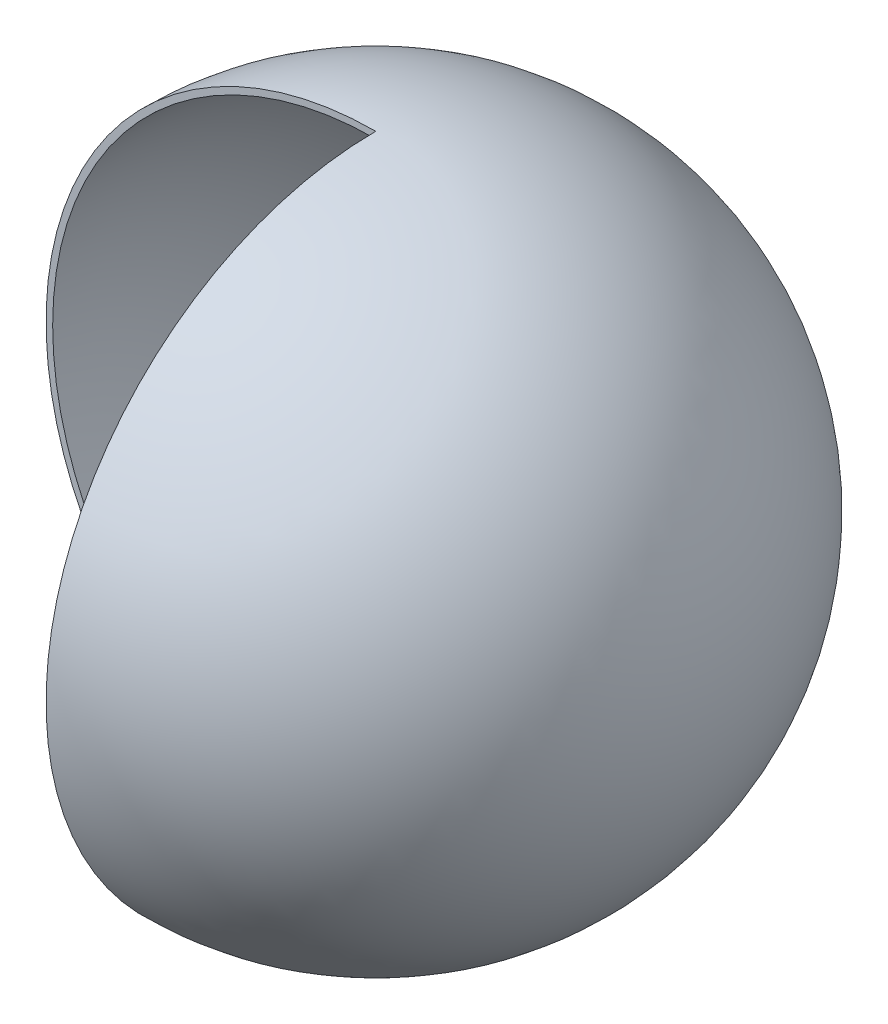
ISO-10303-21;
HEADER;
FILE_DESCRIPTION(('STEP AP214'),'2;1');
FILE_NAME('part.step','',(''),(''),'','','');
FILE_SCHEMA(('AUTOMOTIVE_DESIGN { 1 0 10303 214 1 1 1 1 }'));
ENDSEC;
DATA;
#1=APPLICATION_CONTEXT('core data for automotive mechanical design processes');
#2=APPLICATION_PROTOCOL_DEFINITION('international standard','automotive_design',2000,#1);
#3=PRODUCT_CONTEXT('',#1,'mechanical');
#4=PRODUCT('Part','Part','',(#3));
#5=PRODUCT_RELATED_PRODUCT_CATEGORY('part','',(#4));
#6=PRODUCT_DEFINITION_FORMATION('','',#4);
#7=PRODUCT_DEFINITION_CONTEXT('part definition',#1,'design');
#8=PRODUCT_DEFINITION('design','',#6,#7);
#9=PRODUCT_DEFINITION_SHAPE('','',#8);
#10=(LENGTH_UNIT() NAMED_UNIT(*) SI_UNIT(.MILLI.,.METRE.));
#11=(NAMED_UNIT(*) PLANE_ANGLE_UNIT() SI_UNIT($,.RADIAN.));
#12=(NAMED_UNIT(*) SI_UNIT($,.STERADIAN.) SOLID_ANGLE_UNIT());
#13=UNCERTAINTY_MEASURE_WITH_UNIT(LENGTH_MEASURE(1.E-05),#10,'distance_accuracy_value','');
#14=(GEOMETRIC_REPRESENTATION_CONTEXT(3) GLOBAL_UNCERTAINTY_ASSIGNED_CONTEXT((#13)) GLOBAL_UNIT_ASSIGNED_CONTEXT((#10,
#11,#12)) REPRESENTATION_CONTEXT('',''));
#15=CARTESIAN_POINT('',(0.,0.,0.));
#16=DIRECTION('',(0.,0.,1.));
#17=DIRECTION('',(1.,0.,0.));
#18=AXIS2_PLACEMENT_3D('',#15,#16,#17);
#19=CARTESIAN_POINT('',(0.,0.,0.));
#20=DIRECTION('',(1.,0.,0.));
#21=DIRECTION('',(0.,0.,-1.));
#22=AXIS2_PLACEMENT_3D('',#19,#20,#21);
#23=PLANE('',#22);
#24=CARTESIAN_POINT('',(0.,0.,0.));
#25=DIRECTION('',(1.,0.,0.));
#26=DIRECTION('',(0.,0.,-1.));
#27=AXIS2_PLACEMENT_3D('',#24,#25,#26);
#28=CIRCLE('',#27,147.5);
#29=CARTESIAN_POINT('',(0.,147.5,0.));
#30=VERTEX_POINT('',#29);
#31=CARTESIAN_POINT('',(0.,-147.5,0.));
#32=VERTEX_POINT('',#31);
#33=EDGE_CURVE('E54',#30,#32,#28,.T.);
#34=ORIENTED_EDGE('',*,*,#33,.T.);
#35=DIRECTION('',(0.,1.,0.));
#36=VECTOR('',#35,1.);
#37=CARTESIAN_POINT('',(0.,0.,0.));
#38=LINE('',#37,#36);
#39=CARTESIAN_POINT('',(0.,-150.5,0.));
#40=VERTEX_POINT('',#39);
#41=EDGE_CURVE('E49',#40,#32,#38,.T.);
#42=ORIENTED_EDGE('',*,*,#41,.F.);
#43=CARTESIAN_POINT('',(0.,0.,0.));
#44=DIRECTION('',(1.,0.,0.));
#45=DIRECTION('',(0.,0.,-1.));
#46=AXIS2_PLACEMENT_3D('',#43,#44,#45);
#47=CIRCLE('',#46,150.5);
#48=CARTESIAN_POINT('',(0.,150.5,0.));
#49=VERTEX_POINT('',#48);
#50=EDGE_CURVE('E11',#49,#40,#47,.T.);
#51=ORIENTED_EDGE('',*,*,#50,.F.);
#52=EDGE_CURVE('E77',#30,#49,#38,.T.);
#53=ORIENTED_EDGE('',*,*,#52,.F.);
#54=EDGE_LOOP('',(#34,#42,#51,#53));
#55=FACE_BOUND('',#54,.T.);
#56=ADVANCED_FACE('F45',(#55),#23,.F.);
#57=CARTESIAN_POINT('',(0.,0.,0.));
#58=DIRECTION('',(0.,-1.,0.));
#59=DIRECTION('',(-1.,0.,0.));
#60=AXIS2_PLACEMENT_3D('',#57,#58,#59);
#61=SPHERICAL_SURFACE('',#60,150.5);
#62=ORIENTED_EDGE('',*,*,#50,.T.);
#63=CARTESIAN_POINT('',(0.,0.,0.));
#64=DIRECTION('',(0.,0.,1.));
#65=DIRECTION('',(1.,0.,0.));
#66=AXIS2_PLACEMENT_3D('',#63,#64,#65);
#67=CIRCLE('',#66,150.5);
#68=EDGE_CURVE('E83',#49,#40,#67,.T.);
#69=ORIENTED_EDGE('',*,*,#68,.F.);
#70=EDGE_LOOP('',(#62,#69));
#71=FACE_BOUND('',#70,.T.);
#72=CARTESIAN_POINT('',(0.,0.,-129.832));
#73=DIRECTION('',(0.,0.,1.));
#74=DIRECTION('',(1.,0.,0.));
#75=AXIS2_PLACEMENT_3D('',#72,#73,#74);
#76=CIRCLE('',#75,76.1176837272391);
#77=CARTESIAN_POINT('',(76.1176837272391,0.,-129.832));
#78=VERTEX_POINT('',#77);
#79=EDGE_CURVE('E80',#78,#78,#76,.F.);
#80=ORIENTED_EDGE('',*,*,#79,.F.);
#81=EDGE_LOOP('',(#80));
#82=FACE_BOUND('',#81,.T.);
#83=ADVANCED_FACE('F47',(#71,#82),#61,.T.);
#84=CARTESIAN_POINT('',(0.,0.,0.));
#85=DIRECTION('',(0.,-1.,0.));
#86=DIRECTION('',(1.,0.,0.));
#87=AXIS2_PLACEMENT_3D('',#84,#85,#86);
#88=SPHERICAL_SURFACE('',#87,147.5);
#89=ORIENTED_EDGE('',*,*,#33,.F.);
#90=CARTESIAN_POINT('',(0.,0.,0.));
#91=DIRECTION('',(0.,0.,1.));
#92=DIRECTION('',(1.,0.,0.));
#93=AXIS2_PLACEMENT_3D('',#90,#91,#92);
#94=CIRCLE('',#93,147.5);
#95=EDGE_CURVE('E75',#30,#32,#94,.T.);
#96=ORIENTED_EDGE('',*,*,#95,.T.);
#97=EDGE_LOOP('',(#89,#96));
#98=FACE_BOUND('',#97,.T.);
#99=CARTESIAN_POINT('',(0.,0.,-129.832));
#100=DIRECTION('',(0.,0.,1.));
#101=DIRECTION('',(1.,0.,0.));
#102=AXIS2_PLACEMENT_3D('',#99,#100,#101);
#103=CIRCLE('',#102,69.9992983964839);
#104=CARTESIAN_POINT('',(69.9992983964839,0.,-129.832));
#105=VERTEX_POINT('',#104);
#106=EDGE_CURVE('E82',#105,#105,#103,.T.);
#107=ORIENTED_EDGE('',*,*,#106,.F.);
#108=EDGE_LOOP('',(#107));
#109=FACE_BOUND('',#108,.T.);
#110=ADVANCED_FACE('F72',(#98,#109),#88,.F.);
#111=CARTESIAN_POINT('',(0.,0.,0.));
#112=DIRECTION('',(0.,0.,1.));
#113=DIRECTION('',(1.,0.,0.));
#114=AXIS2_PLACEMENT_3D('',#111,#112,#113);
#115=PLANE('',#114);
#116=ORIENTED_EDGE('',*,*,#52,.T.);
#117=ORIENTED_EDGE('',*,*,#68,.T.);
#118=ORIENTED_EDGE('',*,*,#41,.T.);
#119=ORIENTED_EDGE('',*,*,#95,.F.);
#120=EDGE_LOOP('',(#116,#117,#118,#119));
#121=FACE_BOUND('',#120,.T.);
#122=ADVANCED_FACE('F81',(#121),#115,.T.);
#123=CARTESIAN_POINT('',(0.,0.,-129.832));
#124=DIRECTION('',(0.,0.,1.));
#125=DIRECTION('',(1.,0.,0.));
#126=AXIS2_PLACEMENT_3D('',#123,#124,#125);
#127=PLANE('',#126);
#128=ORIENTED_EDGE('',*,*,#79,.T.);
#129=EDGE_LOOP('',(#128));
#130=FACE_BOUND('',#129,.T.);
#131=ORIENTED_EDGE('',*,*,#106,.T.);
#132=EDGE_LOOP('',(#131));
#133=FACE_BOUND('',#132,.T.);
#134=ADVANCED_FACE('F92',(#130,#133),#127,.F.);
#135=CLOSED_SHELL('',(#56,#83,#110,#122,#134));
#136=MANIFOLD_SOLID_BREP('B2',#135);
#137=ADVANCED_BREP_SHAPE_REPRESENTATION('',(#18,#136),#14);
#138=SHAPE_DEFINITION_REPRESENTATION(#9,#137);
ENDSEC;
END-ISO-10303-21;
